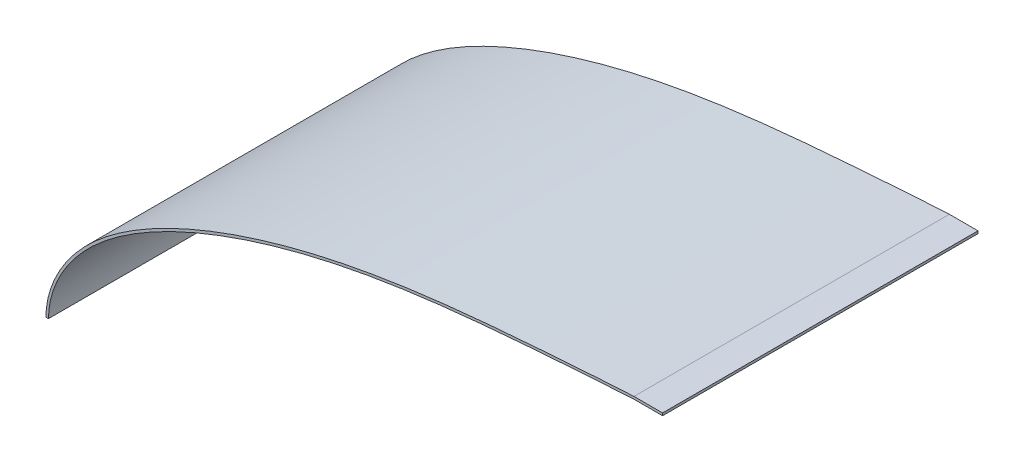
ISO-10303-21;
HEADER;
FILE_DESCRIPTION(('STEP AP214'),'2;1');
FILE_NAME('part.step','',(''),(''),'','','');
FILE_SCHEMA(('AUTOMOTIVE_DESIGN { 1 0 10303 214 1 1 1 1 }'));
ENDSEC;
DATA;
#1=APPLICATION_CONTEXT('core data for automotive mechanical design processes');
#2=APPLICATION_PROTOCOL_DEFINITION('international standard','automotive_design',2000,#1);
#3=PRODUCT_CONTEXT('',#1,'mechanical');
#4=PRODUCT('Part','Part','',(#3));
#5=PRODUCT_RELATED_PRODUCT_CATEGORY('part','',(#4));
#6=PRODUCT_DEFINITION_FORMATION('','',#4);
#7=PRODUCT_DEFINITION_CONTEXT('part definition',#1,'design');
#8=PRODUCT_DEFINITION('design','',#6,#7);
#9=PRODUCT_DEFINITION_SHAPE('','',#8);
#10=(LENGTH_UNIT() NAMED_UNIT(*) SI_UNIT(.MILLI.,.METRE.));
#11=(NAMED_UNIT(*) PLANE_ANGLE_UNIT() SI_UNIT($,.RADIAN.));
#12=(NAMED_UNIT(*) SI_UNIT($,.STERADIAN.) SOLID_ANGLE_UNIT());
#13=UNCERTAINTY_MEASURE_WITH_UNIT(LENGTH_MEASURE(1.E-05),#10,'distance_accuracy_value','');
#14=(GEOMETRIC_REPRESENTATION_CONTEXT(3) GLOBAL_UNCERTAINTY_ASSIGNED_CONTEXT((#13)) GLOBAL_UNIT_ASSIGNED_CONTEXT((#10,
#11,#12)) REPRESENTATION_CONTEXT('',''));
#15=CARTESIAN_POINT('',(0.,0.,0.));
#16=DIRECTION('',(0.,0.,1.));
#17=DIRECTION('',(1.,0.,0.));
#18=AXIS2_PLACEMENT_3D('',#15,#16,#17);
#19=CARTESIAN_POINT('',(-2999.82135414804,-754.730235356195,382.));
#20=CARTESIAN_POINT('',(-3000.78883640939,-754.774387586006,382.));
#21=CARTESIAN_POINT('',(-3002.70356472197,-754.864734656233,382.));
#22=CARTESIAN_POINT('',(-3006.69324983555,-755.064882788454,382.));
#23=CARTESIAN_POINT('',(-3011.85690491208,-755.343441958866,382.));
#24=CARTESIAN_POINT('',(-3018.3424288191,-755.718370570191,382.));
#25=CARTESIAN_POINT('',(-3027.32655639917,-756.264364537581,382.));
#26=CARTESIAN_POINT('',(-3039.13001090123,-757.021071369212,382.));
#27=CARTESIAN_POINT('',(-3054.0294920638,-758.017499418512,382.));
#28=CARTESIAN_POINT('',(-3069.51258361428,-759.082533823183,382.));
#29=CARTESIAN_POINT('',(-3090.76510683952,-760.57932569542,382.));
#30=CARTESIAN_POINT('',(-3118.19548214971,-762.580978901434,382.));
#31=CARTESIAN_POINT('',(-3151.84485496703,-765.220901367333,382.));
#32=CARTESIAN_POINT('',(-3185.80004797906,-768.185846607014,382.));
#33=CARTESIAN_POINT('',(-3219.77632498606,-771.587808066117,382.));
#34=CARTESIAN_POINT('',(-3264.85229720848,-776.857863568012,382.));
#35=CARTESIAN_POINT('',(-3320.42371343575,-785.092891165542,382.));
#36=CARTESIAN_POINT('',(-3384.97690710673,-798.149879427766,382.));
#37=CARTESIAN_POINT('',(-3446.39528361034,-814.440984917432,382.));
#38=CARTESIAN_POINT('',(-3503.44368588345,-833.649543237328,382.));
#39=CARTESIAN_POINT('',(-3554.81546746289,-855.265275946627,382.));
#40=CARTESIAN_POINT('',(-3599.37809212896,-878.75995426854,382.));
#41=CARTESIAN_POINT('',(-3636.39363979011,-903.673069207049,382.));
#42=CARTESIAN_POINT('',(-3665.62351901191,-929.56356866534,382.));
#43=CARTESIAN_POINT('',(-3687.28898562821,-955.848503580371,382.));
#44=CARTESIAN_POINT('',(-3699.48711013274,-977.339549276331,382.));
#45=CARTESIAN_POINT('',(-3706.05689195248,-993.757404120747,382.));
#46=CARTESIAN_POINT('',(-3709.46813267628,-1005.58704337525,382.));
#47=CARTESIAN_POINT('',(-3711.11019459576,-1015.00605913362,382.));
#48=CARTESIAN_POINT('',(-3711.7463441933,-1022.33274719556,382.));
#49=CARTESIAN_POINT('',(-3711.84823825819,-1025.92434560037,382.));
#50=CARTESIAN_POINT('',(-3711.84823825819,-1027.7302353562,382.));
#51=B_SPLINE_CURVE_WITH_KNOTS('',3,(#19,#20,#21,#22,#23,#24,#25,#26,#27,#28,#29,#30,#31,#32,#33,
#34,#35,#36,#37,#38,#39,#40,#41,#42,#43,#44,#45,#46,#47,#48,#49,#50),.UNSPECIFIED.,.F.,.F.,(4,1,
1,1,1,1,1,1,1,1,1,1,1,1,1,1,1,1,1,1,1,1,1,1,1,1,1,1,1,4),(0.,0.0039066156669687,
0.00781323133393741,0.0156264626678749,0.0234396940018124,0.0312529253357499,0.0468793880036249,
0.0625058506714998,0.0781323133393748,0.0937587760072498,0.125011701343,0.15626462667875,
0.187517552014499,0.218770477350249,0.250023402685999,0.312529253357499,0.375035104028999,
0.437540954700499,0.500046805371999,0.562552656043499,0.625058506714998,0.687564357386498,
0.750070208057998,0.812576058729498,0.875081909400998,0.906334834736748,0.937587760072498,
0.968840685408248,0.984467148076123,1.000093610744),.UNSPECIFIED.);
#52=DIRECTION('',(0.,0.,-1.));
#53=VECTOR('',#52,1.);
#54=SURFACE_OF_LINEAR_EXTRUSION('',#51,#53);
#55=CARTESIAN_POINT('',(-2999.82135414804,-754.730235356195,0.));
#56=CARTESIAN_POINT('',(-3000.78883640939,-754.774387586006,0.));
#57=CARTESIAN_POINT('',(-3002.70356472197,-754.864734656233,0.));
#58=CARTESIAN_POINT('',(-3006.69324983555,-755.064882788454,0.));
#59=CARTESIAN_POINT('',(-3011.85690491208,-755.343441958866,0.));
#60=CARTESIAN_POINT('',(-3018.3424288191,-755.718370570191,0.));
#61=CARTESIAN_POINT('',(-3027.32655639917,-756.264364537581,0.));
#62=CARTESIAN_POINT('',(-3039.13001090123,-757.021071369212,0.));
#63=CARTESIAN_POINT('',(-3054.0294920638,-758.017499418512,0.));
#64=CARTESIAN_POINT('',(-3069.51258361428,-759.082533823183,0.));
#65=CARTESIAN_POINT('',(-3090.76510683952,-760.57932569542,0.));
#66=CARTESIAN_POINT('',(-3118.19548214971,-762.580978901434,0.));
#67=CARTESIAN_POINT('',(-3151.84485496703,-765.220901367333,0.));
#68=CARTESIAN_POINT('',(-3185.80004797906,-768.185846607014,0.));
#69=CARTESIAN_POINT('',(-3219.77632498606,-771.587808066117,0.));
#70=CARTESIAN_POINT('',(-3264.85229720848,-776.857863568012,0.));
#71=CARTESIAN_POINT('',(-3320.42371343575,-785.092891165542,0.));
#72=CARTESIAN_POINT('',(-3384.97690710673,-798.149879427766,0.));
#73=CARTESIAN_POINT('',(-3446.39528361034,-814.440984917432,0.));
#74=CARTESIAN_POINT('',(-3503.44368588345,-833.649543237328,0.));
#75=CARTESIAN_POINT('',(-3554.81546746289,-855.265275946627,0.));
#76=CARTESIAN_POINT('',(-3599.37809212896,-878.75995426854,0.));
#77=CARTESIAN_POINT('',(-3636.39363979011,-903.673069207049,0.));
#78=CARTESIAN_POINT('',(-3665.62351901191,-929.56356866534,0.));
#79=CARTESIAN_POINT('',(-3687.28898562821,-955.848503580371,0.));
#80=CARTESIAN_POINT('',(-3699.48711013274,-977.339549276331,0.));
#81=CARTESIAN_POINT('',(-3706.05689195248,-993.757404120747,0.));
#82=CARTESIAN_POINT('',(-3709.46813267628,-1005.58704337525,0.));
#83=CARTESIAN_POINT('',(-3711.11019459576,-1015.00605913362,0.));
#84=CARTESIAN_POINT('',(-3711.7463441933,-1022.33274719556,0.));
#85=CARTESIAN_POINT('',(-3711.84823825819,-1025.92434560037,0.));
#86=CARTESIAN_POINT('',(-3711.84823825819,-1027.7302353562,0.));
#87=B_SPLINE_CURVE_WITH_KNOTS('',3,(#55,#56,#57,#58,#59,#60,#61,#62,#63,#64,#65,#66,#67,#68,#69,
#70,#71,#72,#73,#74,#75,#76,#77,#78,#79,#80,#81,#82,#83,#84,#85,#86),.UNSPECIFIED.,.F.,.F.,(4,1,
1,1,1,1,1,1,1,1,1,1,1,1,1,1,1,1,1,1,1,1,1,1,1,1,1,1,1,4),(0.,0.0039066156669687,
0.00781323133393741,0.0156264626678749,0.0234396940018124,0.0312529253357499,0.0468793880036249,
0.0625058506714998,0.0781323133393748,0.0937587760072498,0.125011701343,0.15626462667875,
0.187517552014499,0.218770477350249,0.250023402685999,0.312529253357499,0.375035104028999,
0.437540954700499,0.500046805371999,0.562552656043499,0.625058506714998,0.687564357386498,
0.750070208057998,0.812576058729498,0.875081909400998,0.906334834736748,0.937587760072498,
0.968840685408248,0.984467148076123,1.000093610744),.UNSPECIFIED.);
#88=CARTESIAN_POINT('',(-2999.82135414804,-754.730235356195,0.));
#89=VERTEX_POINT('',#88);
#90=CARTESIAN_POINT('',(-3711.84823825819,-1027.7302353562,0.));
#91=VERTEX_POINT('',#90);
#92=EDGE_CURVE('E117',#89,#91,#87,.T.);
#93=ORIENTED_EDGE('',*,*,#92,.T.);
#94=DIRECTION('',(0.,0.,-1.));
#95=VECTOR('',#94,1.);
#96=CARTESIAN_POINT('',(-3711.84823825819,-1027.7302353562,382.));
#97=LINE('',#96,#95);
#98=CARTESIAN_POINT('',(-3711.84823825819,-1027.7302353562,382.));
#99=VERTEX_POINT('',#98);
#100=EDGE_CURVE('E11',#99,#91,#97,.T.);
#101=ORIENTED_EDGE('',*,*,#100,.F.);
#102=CARTESIAN_POINT('',(-2999.82135414804,-754.730235356195,382.));
#103=VERTEX_POINT('',#102);
#104=EDGE_CURVE('E137',#103,#99,#51,.T.);
#105=ORIENTED_EDGE('',*,*,#104,.F.);
#106=DIRECTION('',(0.,0.,-1.));
#107=VECTOR('',#106,1.);
#108=CARTESIAN_POINT('',(-2999.82135414804,-754.730235356195,382.));
#109=LINE('',#108,#107);
#110=EDGE_CURVE('E113',#103,#89,#109,.T.);
#111=ORIENTED_EDGE('',*,*,#110,.T.);
#112=EDGE_LOOP('',(#93,#101,#105,#111));
#113=FACE_BOUND('',#112,.T.);
#114=ADVANCED_FACE('F32',(#113),#54,.F.);
#115=CARTESIAN_POINT('',(-3711.84823825819,-1027.7302353562,382.));
#116=DIRECTION('',(0.,1.,0.));
#117=DIRECTION('',(0.,0.,1.));
#118=AXIS2_PLACEMENT_3D('',#115,#116,#117);
#119=PLANE('',#118);
#120=DIRECTION('',(1.,0.,0.));
#121=VECTOR('',#120,1.);
#122=CARTESIAN_POINT('',(-3711.84823825819,-1027.7302353562,0.));
#123=LINE('',#122,#121);
#124=CARTESIAN_POINT('',(-3708.84823825819,-1027.7302353562,0.));
#125=VERTEX_POINT('',#124);
#126=EDGE_CURVE('E122',#91,#125,#123,.T.);
#127=ORIENTED_EDGE('',*,*,#126,.T.);
#128=DIRECTION('',(0.,0.,-1.));
#129=VECTOR('',#128,1.);
#130=CARTESIAN_POINT('',(-3708.84823825819,-1027.7302353562,382.));
#131=LINE('',#130,#129);
#132=CARTESIAN_POINT('',(-3708.84823825819,-1027.7302353562,382.));
#133=VERTEX_POINT('',#132);
#134=EDGE_CURVE('E41',#133,#125,#131,.T.);
#135=ORIENTED_EDGE('',*,*,#134,.F.);
#136=DIRECTION('',(1.,0.,0.));
#137=VECTOR('',#136,1.);
#138=CARTESIAN_POINT('',(-3711.84823825819,-1027.7302353562,382.));
#139=LINE('',#138,#137);
#140=EDGE_CURVE('E86',#99,#133,#139,.T.);
#141=ORIENTED_EDGE('',*,*,#140,.F.);
#142=ORIENTED_EDGE('',*,*,#100,.T.);
#143=EDGE_LOOP('',(#127,#135,#141,#142));
#144=FACE_BOUND('',#143,.T.);
#145=ADVANCED_FACE('F161',(#144),#119,.F.);
#146=CARTESIAN_POINT('',(-3708.84823825819,-1027.7302353562,382.));
#147=CARTESIAN_POINT('',(-3708.84823825819,-994.335817236467,382.));
#148=CARTESIAN_POINT('',(-3695.4016020726,-959.59294575036,382.));
#149=CARTESIAN_POINT('',(-3661.18161311112,-901.688159940182,382.));
#150=CARTESIAN_POINT('',(-3613.51498796405,-871.908555809234,382.));
#151=CARTESIAN_POINT('',(-3524.9960895455,-830.547994516249,382.));
#152=CARTESIAN_POINT('',(-3412.49536282858,-790.841855674984,382.));
#153=CARTESIAN_POINT('',(-3309.92117082198,-774.297631157791,382.));
#154=CARTESIAN_POINT('',(-3209.0014012671,-774.297631157791,382.));
#155=CARTESIAN_POINT('',(-3072.76547794447,-761.062251544036,382.));
#156=CARTESIAN_POINT('',(-2999.75293542826,-757.730235356195,382.));
#157=B_SPLINE_CURVE_WITH_KNOTS('',10,(#146,#147,#148,#149,#150,#151,#152,#153,#154,#155,#156),
.UNSPECIFIED.,.F.,.F.,(11,11),(0.,1.),.UNSPECIFIED.);
#158=DIRECTION('',(0.,0.,-1.));
#159=VECTOR('',#158,1.);
#160=SURFACE_OF_LINEAR_EXTRUSION('',#157,#159);
#161=CARTESIAN_POINT('',(-3708.84823825819,-1027.7302353562,0.));
#162=CARTESIAN_POINT('',(-3708.84823825819,-994.335817236467,0.));
#163=CARTESIAN_POINT('',(-3695.4016020726,-959.59294575036,0.));
#164=CARTESIAN_POINT('',(-3661.18161311112,-901.688159940182,0.));
#165=CARTESIAN_POINT('',(-3613.51498796405,-871.908555809234,0.));
#166=CARTESIAN_POINT('',(-3524.9960895455,-830.547994516249,0.));
#167=CARTESIAN_POINT('',(-3412.49536282858,-790.841855674984,0.));
#168=CARTESIAN_POINT('',(-3309.92117082198,-774.297631157791,0.));
#169=CARTESIAN_POINT('',(-3209.0014012671,-774.297631157791,0.));
#170=CARTESIAN_POINT('',(-3072.76547794447,-761.062251544036,0.));
#171=CARTESIAN_POINT('',(-2999.75293542826,-757.730235356195,0.));
#172=B_SPLINE_CURVE_WITH_KNOTS('',10,(#161,#162,#163,#164,#165,#166,#167,#168,#169,#170,#171),
.UNSPECIFIED.,.F.,.F.,(11,11),(0.,1.),.UNSPECIFIED.);
#173=CARTESIAN_POINT('',(-2999.75293542826,-757.730235356195,0.));
#174=VERTEX_POINT('',#173);
#175=EDGE_CURVE('E127',#125,#174,#172,.T.);
#176=ORIENTED_EDGE('',*,*,#175,.T.);
#177=DIRECTION('',(0.,0.,-1.));
#178=VECTOR('',#177,1.);
#179=CARTESIAN_POINT('',(-2999.75293542826,-757.730235356195,382.));
#180=LINE('',#179,#178);
#181=CARTESIAN_POINT('',(-2999.75293542826,-757.730235356195,382.));
#182=VERTEX_POINT('',#181);
#183=EDGE_CURVE('E108',#182,#174,#180,.T.);
#184=ORIENTED_EDGE('',*,*,#183,.F.);
#185=EDGE_CURVE('E99',#133,#182,#157,.T.);
#186=ORIENTED_EDGE('',*,*,#185,.F.);
#187=ORIENTED_EDGE('',*,*,#134,.T.);
#188=EDGE_LOOP('',(#176,#184,#186,#187));
#189=FACE_BOUND('',#188,.T.);
#190=ADVANCED_FACE('F143',(#189),#160,.F.);
#191=CARTESIAN_POINT('',(-2999.75293542826,-757.730235356195,382.));
#192=DIRECTION('',(0.,1.,0.));
#193=DIRECTION('',(0.,0.,1.));
#194=AXIS2_PLACEMENT_3D('',#191,#192,#193);
#195=PLANE('',#194);
#196=DIRECTION('',(1.,0.,0.));
#197=VECTOR('',#196,1.);
#198=CARTESIAN_POINT('',(-2999.75293542826,-757.730235356195,0.));
#199=LINE('',#198,#197);
#200=CARTESIAN_POINT('',(-2965.16525890807,-757.730235356195,0.));
#201=VERTEX_POINT('',#200);
#202=EDGE_CURVE('E107',#174,#201,#199,.T.);
#203=ORIENTED_EDGE('',*,*,#202,.T.);
#204=DIRECTION('',(0.,0.,-1.));
#205=VECTOR('',#204,1.);
#206=CARTESIAN_POINT('',(-2965.16525890807,-757.730235356195,382.));
#207=LINE('',#206,#205);
#208=CARTESIAN_POINT('',(-2965.16525890807,-757.730235356195,382.));
#209=VERTEX_POINT('',#208);
#210=EDGE_CURVE('E104',#209,#201,#207,.T.);
#211=ORIENTED_EDGE('',*,*,#210,.F.);
#212=DIRECTION('',(1.,0.,0.));
#213=VECTOR('',#212,1.);
#214=CARTESIAN_POINT('',(-2999.75293542826,-757.730235356195,382.));
#215=LINE('',#214,#213);
#216=EDGE_CURVE('E93',#182,#209,#215,.T.);
#217=ORIENTED_EDGE('',*,*,#216,.F.);
#218=ORIENTED_EDGE('',*,*,#183,.T.);
#219=EDGE_LOOP('',(#203,#211,#217,#218));
#220=FACE_BOUND('',#219,.T.);
#221=ADVANCED_FACE('F105',(#220),#195,.F.);
#222=CARTESIAN_POINT('',(-2965.16525890807,-754.730235356195,382.));
#223=DIRECTION('',(-1.,0.,0.));
#224=DIRECTION('',(0.,0.,1.));
#225=AXIS2_PLACEMENT_3D('',#222,#223,#224);
#226=PLANE('',#225);
#227=DIRECTION('',(0.,1.,0.));
#228=VECTOR('',#227,1.);
#229=CARTESIAN_POINT('',(-2965.16525890807,-754.730235356195,0.));
#230=LINE('',#229,#228);
#231=CARTESIAN_POINT('',(-2965.16525890807,-754.730235356195,0.));
#232=VERTEX_POINT('',#231);
#233=EDGE_CURVE('E72',#201,#232,#230,.T.);
#234=ORIENTED_EDGE('',*,*,#233,.T.);
#235=DIRECTION('',(0.,0.,-1.));
#236=VECTOR('',#235,1.);
#237=CARTESIAN_POINT('',(-2965.16525890807,-754.730235356195,382.));
#238=LINE('',#237,#236);
#239=CARTESIAN_POINT('',(-2965.16525890807,-754.730235356195,382.));
#240=VERTEX_POINT('',#239);
#241=EDGE_CURVE('E109',#240,#232,#238,.T.);
#242=ORIENTED_EDGE('',*,*,#241,.F.);
#243=DIRECTION('',(0.,1.,0.));
#244=VECTOR('',#243,1.);
#245=CARTESIAN_POINT('',(-2965.16525890807,-754.730235356195,382.));
#246=LINE('',#245,#244);
#247=EDGE_CURVE('E97',#209,#240,#246,.T.);
#248=ORIENTED_EDGE('',*,*,#247,.F.);
#249=ORIENTED_EDGE('',*,*,#210,.T.);
#250=EDGE_LOOP('',(#234,#242,#248,#249));
#251=FACE_BOUND('',#250,.T.);
#252=ADVANCED_FACE('F111',(#251),#226,.F.);
#253=CARTESIAN_POINT('',(-2999.82135414804,-754.730235356195,382.));
#254=DIRECTION('',(0.,-1.,0.));
#255=DIRECTION('',(0.,0.,-1.));
#256=AXIS2_PLACEMENT_3D('',#253,#254,#255);
#257=PLANE('',#256);
#258=DIRECTION('',(-1.,0.,0.));
#259=VECTOR('',#258,1.);
#260=CARTESIAN_POINT('',(-2999.82135414804,-754.730235356195,0.));
#261=LINE('',#260,#259);
#262=EDGE_CURVE('E78',#232,#89,#261,.T.);
#263=ORIENTED_EDGE('',*,*,#262,.T.);
#264=ORIENTED_EDGE('',*,*,#110,.F.);
#265=DIRECTION('',(-1.,0.,0.));
#266=VECTOR('',#265,1.);
#267=CARTESIAN_POINT('',(-2999.82135414804,-754.730235356195,382.));
#268=LINE('',#267,#266);
#269=EDGE_CURVE('E49',#240,#103,#268,.T.);
#270=ORIENTED_EDGE('',*,*,#269,.F.);
#271=ORIENTED_EDGE('',*,*,#241,.T.);
#272=EDGE_LOOP('',(#263,#264,#270,#271));
#273=FACE_BOUND('',#272,.T.);
#274=ADVANCED_FACE('F150',(#273),#257,.F.);
#275=CARTESIAN_POINT('',(-3502.4975824345,-834.050738968895,382.));
#276=DIRECTION('',(0.,0.,1.));
#277=DIRECTION('',(1.,0.,0.));
#278=AXIS2_PLACEMENT_3D('',#275,#276,#277);
#279=PLANE('',#278);
#280=ORIENTED_EDGE('',*,*,#104,.T.);
#281=ORIENTED_EDGE('',*,*,#140,.T.);
#282=ORIENTED_EDGE('',*,*,#185,.T.);
#283=ORIENTED_EDGE('',*,*,#216,.T.);
#284=ORIENTED_EDGE('',*,*,#247,.T.);
#285=ORIENTED_EDGE('',*,*,#269,.T.);
#286=EDGE_LOOP('',(#280,#281,#282,#283,#284,#285));
#287=FACE_BOUND('',#286,.T.);
#288=ADVANCED_FACE('F95',(#287),#279,.T.);
#289=CARTESIAN_POINT('',(-3502.4975824345,-834.050738968895,0.));
#290=DIRECTION('',(0.,0.,1.));
#291=DIRECTION('',(1.,0.,0.));
#292=AXIS2_PLACEMENT_3D('',#289,#290,#291);
#293=PLANE('',#292);
#294=ORIENTED_EDGE('',*,*,#92,.F.);
#295=ORIENTED_EDGE('',*,*,#262,.F.);
#296=ORIENTED_EDGE('',*,*,#233,.F.);
#297=ORIENTED_EDGE('',*,*,#202,.F.);
#298=ORIENTED_EDGE('',*,*,#175,.F.);
#299=ORIENTED_EDGE('',*,*,#126,.F.);
#300=EDGE_LOOP('',(#294,#295,#296,#297,#298,#299));
#301=FACE_BOUND('',#300,.T.);
#302=ADVANCED_FACE('F146',(#301),#293,.F.);
#303=CLOSED_SHELL('',(#114,#145,#190,#221,#252,#274,#288,#302));
#304=MANIFOLD_SOLID_BREP('B2',#303);
#305=ADVANCED_BREP_SHAPE_REPRESENTATION('',(#18,#304),#14);
#306=SHAPE_DEFINITION_REPRESENTATION(#9,#305);
ENDSEC;
END-ISO-10303-21;
